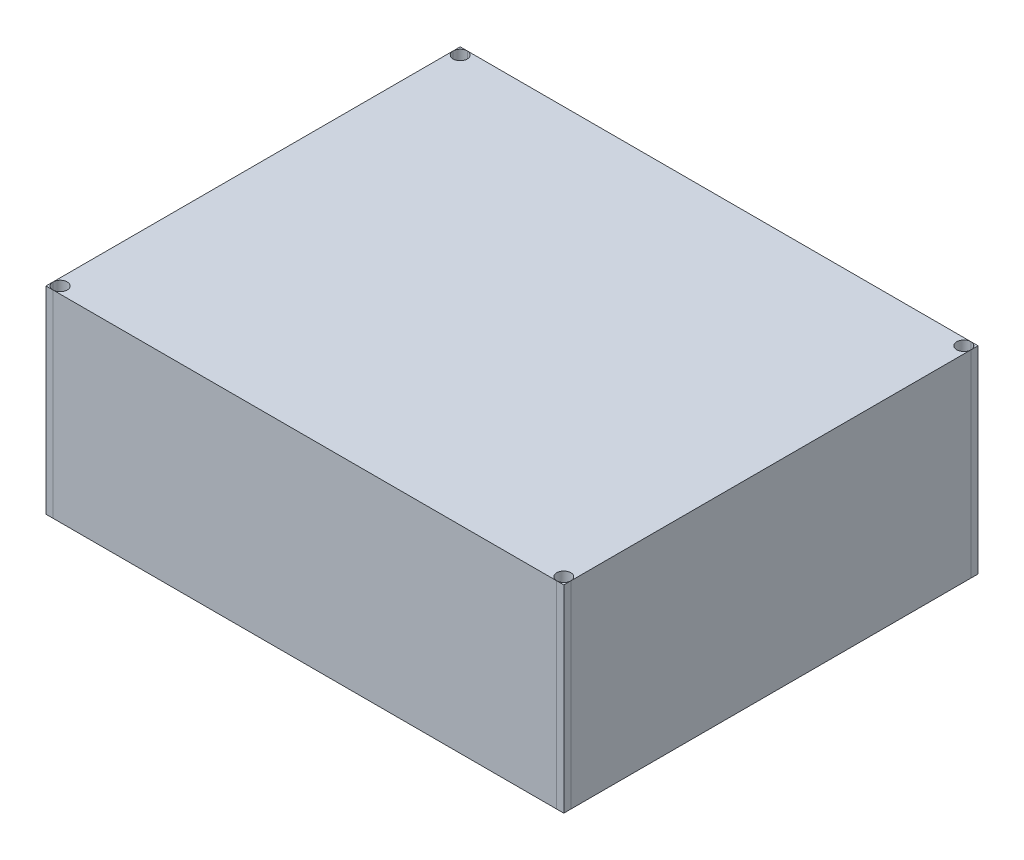
ISO-10303-21;
HEADER;
FILE_DESCRIPTION(('STEP AP214'),'2;1');
FILE_NAME('part.step','',(''),(''),'','','');
FILE_SCHEMA(('AUTOMOTIVE_DESIGN { 1 0 10303 214 1 1 1 1 }'));
ENDSEC;
DATA;
#1=APPLICATION_CONTEXT('core data for automotive mechanical design processes');
#2=APPLICATION_PROTOCOL_DEFINITION('international standard','automotive_design',2000,#1);
#3=PRODUCT_CONTEXT('',#1,'mechanical');
#4=PRODUCT('Part','Part','',(#3));
#5=PRODUCT_RELATED_PRODUCT_CATEGORY('part','',(#4));
#6=PRODUCT_DEFINITION_FORMATION('','',#4);
#7=PRODUCT_DEFINITION_CONTEXT('part definition',#1,'design');
#8=PRODUCT_DEFINITION('design','',#6,#7);
#9=PRODUCT_DEFINITION_SHAPE('','',#8);
#10=(LENGTH_UNIT() NAMED_UNIT(*) SI_UNIT(.MILLI.,.METRE.));
#11=(NAMED_UNIT(*) PLANE_ANGLE_UNIT() SI_UNIT($,.RADIAN.));
#12=(NAMED_UNIT(*) SI_UNIT($,.STERADIAN.) SOLID_ANGLE_UNIT());
#13=UNCERTAINTY_MEASURE_WITH_UNIT(LENGTH_MEASURE(1.E-05),#10,'distance_accuracy_value','');
#14=(GEOMETRIC_REPRESENTATION_CONTEXT(3) GLOBAL_UNCERTAINTY_ASSIGNED_CONTEXT((#13)) GLOBAL_UNIT_ASSIGNED_CONTEXT((#10,
#11,#12)) REPRESENTATION_CONTEXT('',''));
#15=CARTESIAN_POINT('',(0.,0.,0.));
#16=DIRECTION('',(0.,0.,1.));
#17=DIRECTION('',(1.,0.,0.));
#18=AXIS2_PLACEMENT_3D('',#15,#16,#17);
#19=CARTESIAN_POINT('',(-55.,42.,-44.));
#20=DIRECTION('',(1.,0.,0.));
#21=DIRECTION('',(0.,0.,-1.));
#22=AXIS2_PLACEMENT_3D('',#19,#20,#21);
#23=PLANE('',#22);
#24=DIRECTION('',(0.,1.,0.));
#25=VECTOR('',#24,1.);
#26=CARTESIAN_POINT('',(-55.,0.,42.5));
#27=LINE('',#26,#25);
#28=CARTESIAN_POINT('',(-55.,0.,42.5));
#29=VERTEX_POINT('',#28);
#30=CARTESIAN_POINT('',(-55.,42.,42.5));
#31=VERTEX_POINT('',#30);
#32=EDGE_CURVE('E80',#29,#31,#27,.T.);
#33=ORIENTED_EDGE('',*,*,#32,.F.);
#34=DIRECTION('',(0.,0.,1.));
#35=VECTOR('',#34,1.);
#36=CARTESIAN_POINT('',(-55.,0.,-44.));
#37=LINE('',#36,#35);
#38=CARTESIAN_POINT('',(-55.,0.,44.));
#39=VERTEX_POINT('',#38);
#40=EDGE_CURVE('E94',#29,#39,#37,.T.);
#41=ORIENTED_EDGE('',*,*,#40,.T.);
#42=DIRECTION('',(0.,-1.,0.));
#43=VECTOR('',#42,1.);
#44=CARTESIAN_POINT('',(-55.,42.,44.));
#45=LINE('',#44,#43);
#46=CARTESIAN_POINT('',(-55.,42.,44.));
#47=VERTEX_POINT('',#46);
#48=EDGE_CURVE('E83',#47,#39,#45,.T.);
#49=ORIENTED_EDGE('',*,*,#48,.F.);
#50=DIRECTION('',(0.,0.,1.));
#51=VECTOR('',#50,1.);
#52=CARTESIAN_POINT('',(-55.,42.,-44.));
#53=LINE('',#52,#51);
#54=EDGE_CURVE('E48',#31,#47,#53,.T.);
#55=ORIENTED_EDGE('',*,*,#54,.F.);
#56=EDGE_LOOP('',(#33,#41,#49,#55));
#57=FACE_BOUND('',#56,.T.);
#58=ADVANCED_FACE('F44',(#57),#23,.F.);
#59=CARTESIAN_POINT('',(0.,42.,0.));
#60=DIRECTION('',(0.,-1.,0.));
#61=DIRECTION('',(0.,0.,-1.));
#62=AXIS2_PLACEMENT_3D('',#59,#60,#61);
#63=PLANE('',#62);
#64=DIRECTION('',(1.,0.,0.));
#65=VECTOR('',#64,1.);
#66=CARTESIAN_POINT('',(55.,42.,44.));
#67=LINE('',#66,#65);
#68=CARTESIAN_POINT('',(-53.5,42.,44.));
#69=VERTEX_POINT('',#68);
#70=EDGE_CURVE('E88',#47,#69,#67,.T.);
#71=ORIENTED_EDGE('',*,*,#70,.T.);
#72=CARTESIAN_POINT('',(-53.5,42.,42.5));
#73=DIRECTION('',(0.,1.,0.));
#74=DIRECTION('',(0.,0.,1.));
#75=AXIS2_PLACEMENT_3D('',#72,#73,#74);
#76=CIRCLE('',#75,1.5);
#77=EDGE_CURVE('E53',#31,#69,#76,.T.);
#78=ORIENTED_EDGE('',*,*,#77,.F.);
#79=ORIENTED_EDGE('',*,*,#54,.T.);
#80=EDGE_LOOP('',(#71,#78,#79));
#81=FACE_BOUND('',#80,.T.);
#82=ADVANCED_FACE('F89',(#81),#63,.F.);
#83=CARTESIAN_POINT('',(0.,0.,0.));
#84=DIRECTION('',(0.,-1.,0.));
#85=DIRECTION('',(0.,0.,-1.));
#86=AXIS2_PLACEMENT_3D('',#83,#84,#85);
#87=PLANE('',#86);
#88=CARTESIAN_POINT('',(-53.5,0.,42.5));
#89=DIRECTION('',(0.,-1.,0.));
#90=DIRECTION('',(0.,0.,-1.));
#91=AXIS2_PLACEMENT_3D('',#88,#89,#90);
#92=CIRCLE('',#91,1.5);
#93=CARTESIAN_POINT('',(-53.5,0.,44.));
#94=VERTEX_POINT('',#93);
#95=EDGE_CURVE('E12',#94,#29,#92,.T.);
#96=ORIENTED_EDGE('',*,*,#95,.F.);
#97=DIRECTION('',(1.,0.,0.));
#98=VECTOR('',#97,1.);
#99=CARTESIAN_POINT('',(55.,0.,44.));
#100=LINE('',#99,#98);
#101=EDGE_CURVE('E87',#39,#94,#100,.T.);
#102=ORIENTED_EDGE('',*,*,#101,.F.);
#103=ORIENTED_EDGE('',*,*,#40,.F.);
#104=EDGE_LOOP('',(#96,#102,#103));
#105=FACE_BOUND('',#104,.T.);
#106=ADVANCED_FACE('F100',(#105),#87,.T.);
#107=CARTESIAN_POINT('',(55.,42.,44.));
#108=DIRECTION('',(0.,0.,-1.));
#109=DIRECTION('',(-1.,0.,0.));
#110=AXIS2_PLACEMENT_3D('',#107,#108,#109);
#111=PLANE('',#110);
#112=ORIENTED_EDGE('',*,*,#101,.T.);
#113=DIRECTION('',(0.,1.,0.));
#114=VECTOR('',#113,1.);
#115=CARTESIAN_POINT('',(-53.5,0.,44.));
#116=LINE('',#115,#114);
#117=EDGE_CURVE('E65',#94,#69,#116,.T.);
#118=ORIENTED_EDGE('',*,*,#117,.T.);
#119=ORIENTED_EDGE('',*,*,#70,.F.);
#120=ORIENTED_EDGE('',*,*,#48,.T.);
#121=EDGE_LOOP('',(#112,#118,#119,#120));
#122=FACE_BOUND('',#121,.T.);
#123=ADVANCED_FACE('F98',(#122),#111,.F.);
#124=CARTESIAN_POINT('',(-53.5,0.,42.5));
#125=DIRECTION('',(0.,1.,0.));
#126=DIRECTION('',(0.,0.,1.));
#127=AXIS2_PLACEMENT_3D('',#124,#125,#126);
#128=CYLINDRICAL_SURFACE('',#127,1.5);
#129=ORIENTED_EDGE('',*,*,#32,.T.);
#130=ORIENTED_EDGE('',*,*,#77,.T.);
#131=ORIENTED_EDGE('',*,*,#117,.F.);
#132=ORIENTED_EDGE('',*,*,#95,.T.);
#133=EDGE_LOOP('',(#129,#130,#131,#132));
#134=FACE_BOUND('',#133,.T.);
#135=ADVANCED_FACE('F46',(#134),#128,.F.);
#136=CLOSED_SHELL('',(#58,#82,#106,#123,#135));
#137=MANIFOLD_SOLID_BREP('B2',#136);
#138=CARTESIAN_POINT('',(0.,42.,0.));
#139=DIRECTION('',(0.,-1.,0.));
#140=DIRECTION('',(0.,0.,-1.));
#141=AXIS2_PLACEMENT_3D('',#138,#139,#140);
#142=PLANE('',#141);
#143=DIRECTION('',(0.,0.,1.));
#144=VECTOR('',#143,1.);
#145=CARTESIAN_POINT('',(-55.,42.,-44.));
#146=LINE('',#145,#144);
#147=CARTESIAN_POINT('',(-55.,42.,-42.5));
#148=VERTEX_POINT('',#147);
#149=CARTESIAN_POINT('',(-55.,42.,42.5));
#150=VERTEX_POINT('',#149);
#151=EDGE_CURVE('E156',#148,#150,#146,.T.);
#152=ORIENTED_EDGE('',*,*,#151,.T.);
#153=CARTESIAN_POINT('',(-53.5,42.,42.5));
#154=DIRECTION('',(0.,1.,0.));
#155=DIRECTION('',(0.,0.,1.));
#156=AXIS2_PLACEMENT_3D('',#153,#154,#155);
#157=CIRCLE('',#156,1.5);
#158=CARTESIAN_POINT('',(-53.5,42.,44.));
#159=VERTEX_POINT('',#158);
#160=EDGE_CURVE('E42',#159,#150,#157,.T.);
#161=ORIENTED_EDGE('',*,*,#160,.F.);
#162=DIRECTION('',(1.,0.,0.));
#163=VECTOR('',#162,1.);
#164=CARTESIAN_POINT('',(55.,42.,44.));
#165=LINE('',#164,#163);
#166=CARTESIAN_POINT('',(53.5,42.,44.));
#167=VERTEX_POINT('',#166);
#168=EDGE_CURVE('E229',#159,#167,#165,.T.);
#169=ORIENTED_EDGE('',*,*,#168,.T.);
#170=CARTESIAN_POINT('',(53.5,42.,42.5));
#171=DIRECTION('',(0.,1.,0.));
#172=DIRECTION('',(0.,0.,1.));
#173=AXIS2_PLACEMENT_3D('',#170,#171,#172);
#174=CIRCLE('',#173,1.5);
#175=CARTESIAN_POINT('',(55.,42.,42.5));
#176=VERTEX_POINT('',#175);
#177=EDGE_CURVE('E211',#176,#167,#174,.T.);
#178=ORIENTED_EDGE('',*,*,#177,.F.);
#179=DIRECTION('',(0.,0.,-1.));
#180=VECTOR('',#179,1.);
#181=CARTESIAN_POINT('',(55.,42.,-44.));
#182=LINE('',#181,#180);
#183=CARTESIAN_POINT('',(55.,42.,-42.5));
#184=VERTEX_POINT('',#183);
#185=EDGE_CURVE('E237',#176,#184,#182,.T.);
#186=ORIENTED_EDGE('',*,*,#185,.T.);
#187=CARTESIAN_POINT('',(53.5,42.,-42.5));
#188=DIRECTION('',(0.,1.,0.));
#189=DIRECTION('',(0.,0.,1.));
#190=AXIS2_PLACEMENT_3D('',#187,#188,#189);
#191=CIRCLE('',#190,1.5);
#192=CARTESIAN_POINT('',(53.5,42.,-44.));
#193=VERTEX_POINT('',#192);
#194=EDGE_CURVE('E262',#193,#184,#191,.T.);
#195=ORIENTED_EDGE('',*,*,#194,.F.);
#196=DIRECTION('',(-1.,0.,0.));
#197=VECTOR('',#196,1.);
#198=CARTESIAN_POINT('',(55.,42.,-44.));
#199=LINE('',#198,#197);
#200=CARTESIAN_POINT('',(-53.5,42.,-44.));
#201=VERTEX_POINT('',#200);
#202=EDGE_CURVE('E238',#193,#201,#199,.T.);
#203=ORIENTED_EDGE('',*,*,#202,.T.);
#204=CARTESIAN_POINT('',(-53.5,42.,-42.5));
#205=DIRECTION('',(0.,1.,0.));
#206=DIRECTION('',(0.,0.,1.));
#207=AXIS2_PLACEMENT_3D('',#204,#205,#206);
#208=CIRCLE('',#207,1.5);
#209=EDGE_CURVE('E267',#148,#201,#208,.T.);
#210=ORIENTED_EDGE('',*,*,#209,.F.);
#211=EDGE_LOOP('',(#152,#161,#169,#178,#186,#195,#203,#210));
#212=FACE_BOUND('',#211,.T.);
#213=ADVANCED_FACE('F152',(#212),#142,.F.);
#214=CARTESIAN_POINT('',(0.,0.,0.));
#215=DIRECTION('',(0.,-1.,0.));
#216=DIRECTION('',(0.,0.,-1.));
#217=AXIS2_PLACEMENT_3D('',#214,#215,#216);
#218=PLANE('',#217);
#219=CARTESIAN_POINT('',(-53.5,0.,42.5));
#220=DIRECTION('',(0.,1.,0.));
#221=DIRECTION('',(0.,0.,1.));
#222=AXIS2_PLACEMENT_3D('',#219,#220,#221);
#223=CIRCLE('',#222,1.5);
#224=CARTESIAN_POINT('',(-53.5,0.,44.));
#225=VERTEX_POINT('',#224);
#226=CARTESIAN_POINT('',(-55.,0.,42.5));
#227=VERTEX_POINT('',#226);
#228=EDGE_CURVE('E256',#225,#227,#223,.T.);
#229=ORIENTED_EDGE('',*,*,#228,.T.);
#230=DIRECTION('',(0.,0.,1.));
#231=VECTOR('',#230,1.);
#232=CARTESIAN_POINT('',(-55.,0.,-44.));
#233=LINE('',#232,#231);
#234=CARTESIAN_POINT('',(-55.,0.,-42.5));
#235=VERTEX_POINT('',#234);
#236=EDGE_CURVE('E234',#235,#227,#233,.T.);
#237=ORIENTED_EDGE('',*,*,#236,.F.);
#238=CARTESIAN_POINT('',(-53.5,0.,-42.5));
#239=DIRECTION('',(0.,-1.,0.));
#240=DIRECTION('',(0.,0.,-1.));
#241=AXIS2_PLACEMENT_3D('',#238,#239,#240);
#242=CIRCLE('',#241,1.5);
#243=CARTESIAN_POINT('',(-53.5,0.,-44.));
#244=VERTEX_POINT('',#243);
#245=EDGE_CURVE('E247',#244,#235,#242,.T.);
#246=ORIENTED_EDGE('',*,*,#245,.F.);
#247=DIRECTION('',(-1.,0.,0.));
#248=VECTOR('',#247,1.);
#249=CARTESIAN_POINT('',(55.,0.,-44.));
#250=LINE('',#249,#248);
#251=CARTESIAN_POINT('',(53.5,0.,-44.));
#252=VERTEX_POINT('',#251);
#253=EDGE_CURVE('E257',#252,#244,#250,.T.);
#254=ORIENTED_EDGE('',*,*,#253,.F.);
#255=CARTESIAN_POINT('',(53.5,0.,-42.5));
#256=DIRECTION('',(0.,-1.,0.));
#257=DIRECTION('',(0.,0.,-1.));
#258=AXIS2_PLACEMENT_3D('',#255,#256,#257);
#259=CIRCLE('',#258,1.5);
#260=CARTESIAN_POINT('',(55.,0.,-42.5));
#261=VERTEX_POINT('',#260);
#262=EDGE_CURVE('E223',#261,#252,#259,.T.);
#263=ORIENTED_EDGE('',*,*,#262,.F.);
#264=DIRECTION('',(0.,0.,-1.));
#265=VECTOR('',#264,1.);
#266=CARTESIAN_POINT('',(55.,0.,-44.));
#267=LINE('',#266,#265);
#268=CARTESIAN_POINT('',(55.,0.,42.5));
#269=VERTEX_POINT('',#268);
#270=EDGE_CURVE('E249',#269,#261,#267,.T.);
#271=ORIENTED_EDGE('',*,*,#270,.F.);
#272=CARTESIAN_POINT('',(53.5,0.,42.5));
#273=DIRECTION('',(0.,-1.,0.));
#274=DIRECTION('',(0.,0.,-1.));
#275=AXIS2_PLACEMENT_3D('',#272,#273,#274);
#276=CIRCLE('',#275,1.5);
#277=CARTESIAN_POINT('',(53.5,0.,44.));
#278=VERTEX_POINT('',#277);
#279=EDGE_CURVE('E245',#278,#269,#276,.T.);
#280=ORIENTED_EDGE('',*,*,#279,.F.);
#281=DIRECTION('',(1.,0.,0.));
#282=VECTOR('',#281,1.);
#283=CARTESIAN_POINT('',(55.,0.,44.));
#284=LINE('',#283,#282);
#285=EDGE_CURVE('E232',#225,#278,#284,.T.);
#286=ORIENTED_EDGE('',*,*,#285,.F.);
#287=EDGE_LOOP('',(#229,#237,#246,#254,#263,#271,#280,#286));
#288=FACE_BOUND('',#287,.T.);
#289=ADVANCED_FACE('F287',(#288),#218,.T.);
#290=CARTESIAN_POINT('',(55.,42.,-44.));
#291=DIRECTION('',(0.,0.,1.));
#292=DIRECTION('',(1.,0.,0.));
#293=AXIS2_PLACEMENT_3D('',#290,#291,#292);
#294=PLANE('',#293);
#295=ORIENTED_EDGE('',*,*,#253,.T.);
#296=DIRECTION('',(0.,1.,0.));
#297=VECTOR('',#296,1.);
#298=CARTESIAN_POINT('',(-53.5,0.,-44.));
#299=LINE('',#298,#297);
#300=EDGE_CURVE('E252',#244,#201,#299,.T.);
#301=ORIENTED_EDGE('',*,*,#300,.T.);
#302=ORIENTED_EDGE('',*,*,#202,.F.);
#303=DIRECTION('',(0.,1.,0.));
#304=VECTOR('',#303,1.);
#305=CARTESIAN_POINT('',(53.5,0.,-44.));
#306=LINE('',#305,#304);
#307=EDGE_CURVE('E260',#252,#193,#306,.T.);
#308=ORIENTED_EDGE('',*,*,#307,.F.);
#309=EDGE_LOOP('',(#295,#301,#302,#308));
#310=FACE_BOUND('',#309,.T.);
#311=ADVANCED_FACE('F291',(#310),#294,.F.);
#312=CARTESIAN_POINT('',(55.,42.,-44.));
#313=DIRECTION('',(-1.,0.,0.));
#314=DIRECTION('',(0.,0.,1.));
#315=AXIS2_PLACEMENT_3D('',#312,#313,#314);
#316=PLANE('',#315);
#317=ORIENTED_EDGE('',*,*,#270,.T.);
#318=DIRECTION('',(0.,1.,0.));
#319=VECTOR('',#318,1.);
#320=CARTESIAN_POINT('',(55.,0.,-42.5));
#321=LINE('',#320,#319);
#322=EDGE_CURVE('E242',#261,#184,#321,.T.);
#323=ORIENTED_EDGE('',*,*,#322,.T.);
#324=ORIENTED_EDGE('',*,*,#185,.F.);
#325=DIRECTION('',(0.,1.,0.));
#326=VECTOR('',#325,1.);
#327=CARTESIAN_POINT('',(55.,0.,42.5));
#328=LINE('',#327,#326);
#329=EDGE_CURVE('E218',#269,#176,#328,.T.);
#330=ORIENTED_EDGE('',*,*,#329,.F.);
#331=EDGE_LOOP('',(#317,#323,#324,#330));
#332=FACE_BOUND('',#331,.T.);
#333=ADVANCED_FACE('F298',(#332),#316,.F.);
#334=CARTESIAN_POINT('',(55.,42.,44.));
#335=DIRECTION('',(0.,0.,-1.));
#336=DIRECTION('',(-1.,0.,0.));
#337=AXIS2_PLACEMENT_3D('',#334,#335,#336);
#338=PLANE('',#337);
#339=DIRECTION('',(0.,1.,0.));
#340=VECTOR('',#339,1.);
#341=CARTESIAN_POINT('',(-53.5,0.,44.));
#342=LINE('',#341,#340);
#343=EDGE_CURVE('E162',#225,#159,#342,.T.);
#344=ORIENTED_EDGE('',*,*,#343,.F.);
#345=ORIENTED_EDGE('',*,*,#285,.T.);
#346=DIRECTION('',(0.,1.,0.));
#347=VECTOR('',#346,1.);
#348=CARTESIAN_POINT('',(53.5,0.,44.));
#349=LINE('',#348,#347);
#350=EDGE_CURVE('E215',#278,#167,#349,.T.);
#351=ORIENTED_EDGE('',*,*,#350,.T.);
#352=ORIENTED_EDGE('',*,*,#168,.F.);
#353=EDGE_LOOP('',(#344,#345,#351,#352));
#354=FACE_BOUND('',#353,.T.);
#355=ADVANCED_FACE('F228',(#354),#338,.F.);
#356=CARTESIAN_POINT('',(-55.,42.,-44.));
#357=DIRECTION('',(1.,0.,0.));
#358=DIRECTION('',(0.,0.,-1.));
#359=AXIS2_PLACEMENT_3D('',#356,#357,#358);
#360=PLANE('',#359);
#361=ORIENTED_EDGE('',*,*,#236,.T.);
#362=DIRECTION('',(0.,1.,0.));
#363=VECTOR('',#362,1.);
#364=CARTESIAN_POINT('',(-55.,0.,42.5));
#365=LINE('',#364,#363);
#366=EDGE_CURVE('E170',#227,#150,#365,.T.);
#367=ORIENTED_EDGE('',*,*,#366,.T.);
#368=ORIENTED_EDGE('',*,*,#151,.F.);
#369=DIRECTION('',(0.,1.,0.));
#370=VECTOR('',#369,1.);
#371=CARTESIAN_POINT('',(-55.,0.,-42.5));
#372=LINE('',#371,#370);
#373=EDGE_CURVE('E266',#235,#148,#372,.T.);
#374=ORIENTED_EDGE('',*,*,#373,.F.);
#375=EDGE_LOOP('',(#361,#367,#368,#374));
#376=FACE_BOUND('',#375,.T.);
#377=ADVANCED_FACE('F285',(#376),#360,.F.);
#378=CARTESIAN_POINT('',(53.5,0.,42.5));
#379=DIRECTION('',(0.,1.,0.));
#380=DIRECTION('',(0.,0.,1.));
#381=AXIS2_PLACEMENT_3D('',#378,#379,#380);
#382=CYLINDRICAL_SURFACE('',#381,1.5);
#383=ORIENTED_EDGE('',*,*,#279,.T.);
#384=ORIENTED_EDGE('',*,*,#329,.T.);
#385=ORIENTED_EDGE('',*,*,#177,.T.);
#386=ORIENTED_EDGE('',*,*,#350,.F.);
#387=EDGE_LOOP('',(#383,#384,#385,#386));
#388=FACE_BOUND('',#387,.T.);
#389=ADVANCED_FACE('F214',(#388),#382,.F.);
#390=CARTESIAN_POINT('',(53.5,0.,-42.5));
#391=DIRECTION('',(0.,1.,0.));
#392=DIRECTION('',(0.,0.,1.));
#393=AXIS2_PLACEMENT_3D('',#390,#391,#392);
#394=CYLINDRICAL_SURFACE('',#393,1.5);
#395=ORIENTED_EDGE('',*,*,#262,.T.);
#396=ORIENTED_EDGE('',*,*,#307,.T.);
#397=ORIENTED_EDGE('',*,*,#194,.T.);
#398=ORIENTED_EDGE('',*,*,#322,.F.);
#399=EDGE_LOOP('',(#395,#396,#397,#398));
#400=FACE_BOUND('',#399,.T.);
#401=ADVANCED_FACE('F296',(#400),#394,.F.);
#402=CARTESIAN_POINT('',(-53.5,0.,-42.5));
#403=DIRECTION('',(0.,1.,0.));
#404=DIRECTION('',(0.,0.,1.));
#405=AXIS2_PLACEMENT_3D('',#402,#403,#404);
#406=CYLINDRICAL_SURFACE('',#405,1.5);
#407=ORIENTED_EDGE('',*,*,#373,.T.);
#408=ORIENTED_EDGE('',*,*,#209,.T.);
#409=ORIENTED_EDGE('',*,*,#300,.F.);
#410=ORIENTED_EDGE('',*,*,#245,.T.);
#411=EDGE_LOOP('',(#407,#408,#409,#410));
#412=FACE_BOUND('',#411,.T.);
#413=ADVANCED_FACE('F279',(#412),#406,.F.);
#414=CARTESIAN_POINT('',(-53.5,0.,42.5));
#415=DIRECTION('',(0.,1.,0.));
#416=DIRECTION('',(0.,0.,1.));
#417=AXIS2_PLACEMENT_3D('',#414,#415,#416);
#418=CYLINDRICAL_SURFACE('',#417,1.5);
#419=ORIENTED_EDGE('',*,*,#228,.F.);
#420=ORIENTED_EDGE('',*,*,#343,.T.);
#421=ORIENTED_EDGE('',*,*,#160,.T.);
#422=ORIENTED_EDGE('',*,*,#366,.F.);
#423=EDGE_LOOP('',(#419,#420,#421,#422));
#424=FACE_BOUND('',#423,.T.);
#425=ADVANCED_FACE('F154',(#424),#418,.F.);
#426=CLOSED_SHELL('',(#213,#289,#311,#333,#355,#377,#389,#401,#413,#425));
#427=MANIFOLD_SOLID_BREP('B6',#426);
#428=CARTESIAN_POINT('',(0.,42.,0.));
#429=DIRECTION('',(0.,-1.,0.));
#430=DIRECTION('',(0.,0.,-1.));
#431=AXIS2_PLACEMENT_3D('',#428,#429,#430);
#432=PLANE('',#431);
#433=DIRECTION('',(0.,0.,-1.));
#434=VECTOR('',#433,1.);
#435=CARTESIAN_POINT('',(55.,42.,-44.));
#436=LINE('',#435,#434);
#437=CARTESIAN_POINT('',(55.,42.,44.));
#438=VERTEX_POINT('',#437);
#439=CARTESIAN_POINT('',(55.,42.,42.5));
#440=VERTEX_POINT('',#439);
#441=EDGE_CURVE('E428',#438,#440,#436,.T.);
#442=ORIENTED_EDGE('',*,*,#441,.T.);
#443=CARTESIAN_POINT('',(53.5,42.,42.5));
#444=DIRECTION('',(0.,1.,0.));
#445=DIRECTION('',(0.,0.,1.));
#446=AXIS2_PLACEMENT_3D('',#443,#444,#445);
#447=CIRCLE('',#446,1.5);
#448=CARTESIAN_POINT('',(53.5,42.,44.));
#449=VERTEX_POINT('',#448);
#450=EDGE_CURVE('E150',#449,#440,#447,.T.);
#451=ORIENTED_EDGE('',*,*,#450,.F.);
#452=DIRECTION('',(1.,0.,0.));
#453=VECTOR('',#452,1.);
#454=CARTESIAN_POINT('',(55.,42.,44.));
#455=LINE('',#454,#453);
#456=EDGE_CURVE('E394',#449,#438,#455,.T.);
#457=ORIENTED_EDGE('',*,*,#456,.T.);
#458=EDGE_LOOP('',(#442,#451,#457));
#459=FACE_BOUND('',#458,.T.);
#460=ADVANCED_FACE('F390',(#459),#432,.F.);
#461=CARTESIAN_POINT('',(0.,0.,0.));
#462=DIRECTION('',(0.,-1.,0.));
#463=DIRECTION('',(0.,0.,-1.));
#464=AXIS2_PLACEMENT_3D('',#461,#462,#463);
#465=PLANE('',#464);
#466=CARTESIAN_POINT('',(53.5,0.,42.5));
#467=DIRECTION('',(0.,1.,0.));
#468=DIRECTION('',(0.,0.,1.));
#469=AXIS2_PLACEMENT_3D('',#466,#467,#468);
#470=CIRCLE('',#469,1.5);
#471=CARTESIAN_POINT('',(53.5,0.,44.));
#472=VERTEX_POINT('',#471);
#473=CARTESIAN_POINT('',(55.,0.,42.5));
#474=VERTEX_POINT('',#473);
#475=EDGE_CURVE('E407',#472,#474,#470,.T.);
#476=ORIENTED_EDGE('',*,*,#475,.T.);
#477=DIRECTION('',(0.,0.,-1.));
#478=VECTOR('',#477,1.);
#479=CARTESIAN_POINT('',(55.,0.,-44.));
#480=LINE('',#479,#478);
#481=CARTESIAN_POINT('',(55.,0.,44.));
#482=VERTEX_POINT('',#481);
#483=EDGE_CURVE('E440',#482,#474,#480,.T.);
#484=ORIENTED_EDGE('',*,*,#483,.F.);
#485=DIRECTION('',(1.,0.,0.));
#486=VECTOR('',#485,1.);
#487=CARTESIAN_POINT('',(55.,0.,44.));
#488=LINE('',#487,#486);
#489=EDGE_CURVE('E433',#472,#482,#488,.T.);
#490=ORIENTED_EDGE('',*,*,#489,.F.);
#491=EDGE_LOOP('',(#476,#484,#490));
#492=FACE_BOUND('',#491,.T.);
#493=ADVANCED_FACE('F445',(#492),#465,.T.);
#494=CARTESIAN_POINT('',(55.,42.,-44.));
#495=DIRECTION('',(-1.,0.,0.));
#496=DIRECTION('',(0.,0.,1.));
#497=AXIS2_PLACEMENT_3D('',#494,#495,#496);
#498=PLANE('',#497);
#499=ORIENTED_EDGE('',*,*,#483,.T.);
#500=DIRECTION('',(0.,1.,0.));
#501=VECTOR('',#500,1.);
#502=CARTESIAN_POINT('',(55.,0.,42.5));
#503=LINE('',#502,#501);
#504=EDGE_CURVE('E412',#474,#440,#503,.T.);
#505=ORIENTED_EDGE('',*,*,#504,.T.);
#506=ORIENTED_EDGE('',*,*,#441,.F.);
#507=DIRECTION('',(0.,-1.,0.));
#508=VECTOR('',#507,1.);
#509=CARTESIAN_POINT('',(55.,42.,44.));
#510=LINE('',#509,#508);
#511=EDGE_CURVE('E431',#438,#482,#510,.T.);
#512=ORIENTED_EDGE('',*,*,#511,.T.);
#513=EDGE_LOOP('',(#499,#505,#506,#512));
#514=FACE_BOUND('',#513,.T.);
#515=ADVANCED_FACE('F437',(#514),#498,.F.);
#516=CARTESIAN_POINT('',(55.,42.,44.));
#517=DIRECTION('',(0.,0.,-1.));
#518=DIRECTION('',(-1.,0.,0.));
#519=AXIS2_PLACEMENT_3D('',#516,#517,#518);
#520=PLANE('',#519);
#521=DIRECTION('',(0.,1.,0.));
#522=VECTOR('',#521,1.);
#523=CARTESIAN_POINT('',(53.5,0.,44.));
#524=LINE('',#523,#522);
#525=EDGE_CURVE('E399',#472,#449,#524,.T.);
#526=ORIENTED_EDGE('',*,*,#525,.F.);
#527=ORIENTED_EDGE('',*,*,#489,.T.);
#528=ORIENTED_EDGE('',*,*,#511,.F.);
#529=ORIENTED_EDGE('',*,*,#456,.F.);
#530=EDGE_LOOP('',(#526,#527,#528,#529));
#531=FACE_BOUND('',#530,.T.);
#532=ADVANCED_FACE('F392',(#531),#520,.F.);
#533=CARTESIAN_POINT('',(53.5,0.,42.5));
#534=DIRECTION('',(0.,1.,0.));
#535=DIRECTION('',(0.,0.,1.));
#536=AXIS2_PLACEMENT_3D('',#533,#534,#535);
#537=CYLINDRICAL_SURFACE('',#536,1.5);
#538=ORIENTED_EDGE('',*,*,#525,.T.);
#539=ORIENTED_EDGE('',*,*,#450,.T.);
#540=ORIENTED_EDGE('',*,*,#504,.F.);
#541=ORIENTED_EDGE('',*,*,#475,.F.);
#542=EDGE_LOOP('',(#538,#539,#540,#541));
#543=FACE_BOUND('',#542,.T.);
#544=ADVANCED_FACE('F454',(#543),#537,.F.);
#545=CLOSED_SHELL('',(#460,#493,#515,#532,#544));
#546=MANIFOLD_SOLID_BREP('B36',#545);
#547=CARTESIAN_POINT('',(0.,42.,0.));
#548=DIRECTION('',(0.,-1.,0.));
#549=DIRECTION('',(0.,0.,-1.));
#550=AXIS2_PLACEMENT_3D('',#547,#548,#549);
#551=PLANE('',#550);
#552=DIRECTION('',(-1.,0.,0.));
#553=VECTOR('',#552,1.);
#554=CARTESIAN_POINT('',(55.,42.,-44.));
#555=LINE('',#554,#553);
#556=CARTESIAN_POINT('',(55.,42.,-44.));
#557=VERTEX_POINT('',#556);
#558=CARTESIAN_POINT('',(53.5,42.,-44.));
#559=VERTEX_POINT('',#558);
#560=EDGE_CURVE('E535',#557,#559,#555,.T.);
#561=ORIENTED_EDGE('',*,*,#560,.T.);
#562=CARTESIAN_POINT('',(53.5,42.,-42.5));
#563=DIRECTION('',(0.,1.,0.));
#564=DIRECTION('',(0.,0.,1.));
#565=AXIS2_PLACEMENT_3D('',#562,#563,#564);
#566=CIRCLE('',#565,1.5);
#567=CARTESIAN_POINT('',(55.,42.,-42.5));
#568=VERTEX_POINT('',#567);
#569=EDGE_CURVE('E388',#568,#559,#566,.T.);
#570=ORIENTED_EDGE('',*,*,#569,.F.);
#571=DIRECTION('',(0.,0.,-1.));
#572=VECTOR('',#571,1.);
#573=CARTESIAN_POINT('',(55.,42.,-44.));
#574=LINE('',#573,#572);
#575=EDGE_CURVE('E501',#568,#557,#574,.T.);
#576=ORIENTED_EDGE('',*,*,#575,.T.);
#577=EDGE_LOOP('',(#561,#570,#576));
#578=FACE_BOUND('',#577,.T.);
#579=ADVANCED_FACE('F497',(#578),#551,.F.);
#580=CARTESIAN_POINT('',(0.,0.,0.));
#581=DIRECTION('',(0.,-1.,0.));
#582=DIRECTION('',(0.,0.,-1.));
#583=AXIS2_PLACEMENT_3D('',#580,#581,#582);
#584=PLANE('',#583);
#585=CARTESIAN_POINT('',(53.5,0.,-42.5));
#586=DIRECTION('',(0.,1.,0.));
#587=DIRECTION('',(0.,0.,1.));
#588=AXIS2_PLACEMENT_3D('',#585,#586,#587);
#589=CIRCLE('',#588,1.5);
#590=CARTESIAN_POINT('',(55.,0.,-42.5));
#591=VERTEX_POINT('',#590);
#592=CARTESIAN_POINT('',(53.5,0.,-44.));
#593=VERTEX_POINT('',#592);
#594=EDGE_CURVE('E514',#591,#593,#589,.T.);
#595=ORIENTED_EDGE('',*,*,#594,.T.);
#596=DIRECTION('',(-1.,0.,0.));
#597=VECTOR('',#596,1.);
#598=CARTESIAN_POINT('',(55.,0.,-44.));
#599=LINE('',#598,#597);
#600=CARTESIAN_POINT('',(55.,0.,-44.));
#601=VERTEX_POINT('',#600);
#602=EDGE_CURVE('E548',#601,#593,#599,.T.);
#603=ORIENTED_EDGE('',*,*,#602,.F.);
#604=DIRECTION('',(0.,0.,-1.));
#605=VECTOR('',#604,1.);
#606=CARTESIAN_POINT('',(55.,0.,-44.));
#607=LINE('',#606,#605);
#608=EDGE_CURVE('E540',#591,#601,#607,.T.);
#609=ORIENTED_EDGE('',*,*,#608,.F.);
#610=EDGE_LOOP('',(#595,#603,#609));
#611=FACE_BOUND('',#610,.T.);
#612=ADVANCED_FACE('F553',(#611),#584,.T.);
#613=CARTESIAN_POINT('',(55.,42.,-44.));
#614=DIRECTION('',(0.,0.,1.));
#615=DIRECTION('',(1.,0.,0.));
#616=AXIS2_PLACEMENT_3D('',#613,#614,#615);
#617=PLANE('',#616);
#618=ORIENTED_EDGE('',*,*,#602,.T.);
#619=DIRECTION('',(0.,1.,0.));
#620=VECTOR('',#619,1.);
#621=CARTESIAN_POINT('',(53.5,0.,-44.));
#622=LINE('',#621,#620);
#623=EDGE_CURVE('E519',#593,#559,#622,.T.);
#624=ORIENTED_EDGE('',*,*,#623,.T.);
#625=ORIENTED_EDGE('',*,*,#560,.F.);
#626=DIRECTION('',(0.,-1.,0.));
#627=VECTOR('',#626,1.);
#628=CARTESIAN_POINT('',(55.,42.,-44.));
#629=LINE('',#628,#627);
#630=EDGE_CURVE('E538',#557,#601,#629,.T.);
#631=ORIENTED_EDGE('',*,*,#630,.T.);
#632=EDGE_LOOP('',(#618,#624,#625,#631));
#633=FACE_BOUND('',#632,.T.);
#634=ADVANCED_FACE('F544',(#633),#617,.F.);
#635=CARTESIAN_POINT('',(55.,42.,-44.));
#636=DIRECTION('',(-1.,0.,0.));
#637=DIRECTION('',(0.,0.,1.));
#638=AXIS2_PLACEMENT_3D('',#635,#636,#637);
#639=PLANE('',#638);
#640=DIRECTION('',(0.,1.,0.));
#641=VECTOR('',#640,1.);
#642=CARTESIAN_POINT('',(55.,0.,-42.5));
#643=LINE('',#642,#641);
#644=EDGE_CURVE('E506',#591,#568,#643,.T.);
#645=ORIENTED_EDGE('',*,*,#644,.F.);
#646=ORIENTED_EDGE('',*,*,#608,.T.);
#647=ORIENTED_EDGE('',*,*,#630,.F.);
#648=ORIENTED_EDGE('',*,*,#575,.F.);
#649=EDGE_LOOP('',(#645,#646,#647,#648));
#650=FACE_BOUND('',#649,.T.);
#651=ADVANCED_FACE('F499',(#650),#639,.F.);
#652=CARTESIAN_POINT('',(53.5,0.,-42.5));
#653=DIRECTION('',(0.,1.,0.));
#654=DIRECTION('',(0.,0.,1.));
#655=AXIS2_PLACEMENT_3D('',#652,#653,#654);
#656=CYLINDRICAL_SURFACE('',#655,1.5);
#657=ORIENTED_EDGE('',*,*,#644,.T.);
#658=ORIENTED_EDGE('',*,*,#569,.T.);
#659=ORIENTED_EDGE('',*,*,#623,.F.);
#660=ORIENTED_EDGE('',*,*,#594,.F.);
#661=EDGE_LOOP('',(#657,#658,#659,#660));
#662=FACE_BOUND('',#661,.T.);
#663=ADVANCED_FACE('F551',(#662),#656,.F.);
#664=CLOSED_SHELL('',(#579,#612,#634,#651,#663));
#665=MANIFOLD_SOLID_BREP('B144',#664);
#666=CARTESIAN_POINT('',(0.,42.,0.));
#667=DIRECTION('',(0.,-1.,0.));
#668=DIRECTION('',(0.,0.,-1.));
#669=AXIS2_PLACEMENT_3D('',#666,#667,#668);
#670=PLANE('',#669);
#671=DIRECTION('',(0.,0.,1.));
#672=VECTOR('',#671,1.);
#673=CARTESIAN_POINT('',(-55.,42.,-44.));
#674=LINE('',#673,#672);
#675=CARTESIAN_POINT('',(-55.,42.,-44.));
#676=VERTEX_POINT('',#675);
#677=CARTESIAN_POINT('',(-55.,42.,-42.5));
#678=VERTEX_POINT('',#677);
#679=EDGE_CURVE('E642',#676,#678,#674,.T.);
#680=ORIENTED_EDGE('',*,*,#679,.T.);
#681=CARTESIAN_POINT('',(-53.5,42.,-42.5));
#682=DIRECTION('',(0.,1.,0.));
#683=DIRECTION('',(0.,0.,1.));
#684=AXIS2_PLACEMENT_3D('',#681,#682,#683);
#685=CIRCLE('',#684,1.5);
#686=CARTESIAN_POINT('',(-53.5,42.,-44.));
#687=VERTEX_POINT('',#686);
#688=EDGE_CURVE('E632',#687,#678,#685,.T.);
#689=ORIENTED_EDGE('',*,*,#688,.F.);
#690=DIRECTION('',(-1.,0.,0.));
#691=VECTOR('',#690,1.);
#692=CARTESIAN_POINT('',(55.,42.,-44.));
#693=LINE('',#692,#691);
#694=EDGE_CURVE('E639',#687,#676,#693,.T.);
#695=ORIENTED_EDGE('',*,*,#694,.T.);
#696=EDGE_LOOP('',(#680,#689,#695));
#697=FACE_BOUND('',#696,.T.);
#698=ADVANCED_FACE('F595',(#697),#670,.F.);
#699=CARTESIAN_POINT('',(0.,0.,0.));
#700=DIRECTION('',(0.,-1.,0.));
#701=DIRECTION('',(0.,0.,-1.));
#702=AXIS2_PLACEMENT_3D('',#699,#700,#701);
#703=PLANE('',#702);
#704=CARTESIAN_POINT('',(-53.5,0.,-42.5));
#705=DIRECTION('',(0.,1.,0.));
#706=DIRECTION('',(0.,0.,1.));
#707=AXIS2_PLACEMENT_3D('',#704,#705,#706);
#708=CIRCLE('',#707,1.5);
#709=CARTESIAN_POINT('',(-53.5,0.,-44.));
#710=VERTEX_POINT('',#709);
#711=CARTESIAN_POINT('',(-55.,0.,-42.5));
#712=VERTEX_POINT('',#711);
#713=EDGE_CURVE('E626',#710,#712,#708,.T.);
#714=ORIENTED_EDGE('',*,*,#713,.T.);
#715=DIRECTION('',(0.,0.,1.));
#716=VECTOR('',#715,1.);
#717=CARTESIAN_POINT('',(-55.,0.,-44.));
#718=LINE('',#717,#716);
#719=CARTESIAN_POINT('',(-55.,0.,-44.));
#720=VERTEX_POINT('',#719);
#721=EDGE_CURVE('E631',#720,#712,#718,.T.);
#722=ORIENTED_EDGE('',*,*,#721,.F.);
#723=DIRECTION('',(-1.,0.,0.));
#724=VECTOR('',#723,1.);
#725=CARTESIAN_POINT('',(55.,0.,-44.));
#726=LINE('',#725,#724);
#727=EDGE_CURVE('E637',#710,#720,#726,.T.);
#728=ORIENTED_EDGE('',*,*,#727,.F.);
#729=EDGE_LOOP('',(#714,#722,#728));
#730=FACE_BOUND('',#729,.T.);
#731=ADVANCED_FACE('F641',(#730),#703,.T.);
#732=CARTESIAN_POINT('',(55.,42.,-44.));
#733=DIRECTION('',(0.,0.,1.));
#734=DIRECTION('',(1.,0.,0.));
#735=AXIS2_PLACEMENT_3D('',#732,#733,#734);
#736=PLANE('',#735);
#737=DIRECTION('',(0.,1.,0.));
#738=VECTOR('',#737,1.);
#739=CARTESIAN_POINT('',(-53.5,0.,-44.));
#740=LINE('',#739,#738);
#741=EDGE_CURVE('E495',#710,#687,#740,.T.);
#742=ORIENTED_EDGE('',*,*,#741,.F.);
#743=ORIENTED_EDGE('',*,*,#727,.T.);
#744=DIRECTION('',(0.,-1.,0.));
#745=VECTOR('',#744,1.);
#746=CARTESIAN_POINT('',(-55.,42.,-44.));
#747=LINE('',#746,#745);
#748=EDGE_CURVE('E599',#676,#720,#747,.T.);
#749=ORIENTED_EDGE('',*,*,#748,.F.);
#750=ORIENTED_EDGE('',*,*,#694,.F.);
#751=EDGE_LOOP('',(#742,#743,#749,#750));
#752=FACE_BOUND('',#751,.T.);
#753=ADVANCED_FACE('F635',(#752),#736,.F.);
#754=CARTESIAN_POINT('',(-55.,42.,-44.));
#755=DIRECTION('',(1.,0.,0.));
#756=DIRECTION('',(0.,0.,-1.));
#757=AXIS2_PLACEMENT_3D('',#754,#755,#756);
#758=PLANE('',#757);
#759=ORIENTED_EDGE('',*,*,#721,.T.);
#760=DIRECTION('',(0.,1.,0.));
#761=VECTOR('',#760,1.);
#762=CARTESIAN_POINT('',(-55.,0.,-42.5));
#763=LINE('',#762,#761);
#764=EDGE_CURVE('E604',#712,#678,#763,.T.);
#765=ORIENTED_EDGE('',*,*,#764,.T.);
#766=ORIENTED_EDGE('',*,*,#679,.F.);
#767=ORIENTED_EDGE('',*,*,#748,.T.);
#768=EDGE_LOOP('',(#759,#765,#766,#767));
#769=FACE_BOUND('',#768,.T.);
#770=ADVANCED_FACE('F597',(#769),#758,.F.);
#771=CARTESIAN_POINT('',(-53.5,0.,-42.5));
#772=DIRECTION('',(0.,1.,0.));
#773=DIRECTION('',(0.,0.,1.));
#774=AXIS2_PLACEMENT_3D('',#771,#772,#773);
#775=CYLINDRICAL_SURFACE('',#774,1.5);
#776=ORIENTED_EDGE('',*,*,#713,.F.);
#777=ORIENTED_EDGE('',*,*,#741,.T.);
#778=ORIENTED_EDGE('',*,*,#688,.T.);
#779=ORIENTED_EDGE('',*,*,#764,.F.);
#780=EDGE_LOOP('',(#776,#777,#778,#779));
#781=FACE_BOUND('',#780,.T.);
#782=ADVANCED_FACE('F627',(#781),#775,.F.);
#783=CLOSED_SHELL('',(#698,#731,#753,#770,#782));
#784=MANIFOLD_SOLID_BREP('B382',#783);
#785=ADVANCED_BREP_SHAPE_REPRESENTATION('',(#18,#137,#427,#546,#665,#784),#14);
#786=SHAPE_DEFINITION_REPRESENTATION(#9,#785);
ENDSEC;
END-ISO-10303-21;
